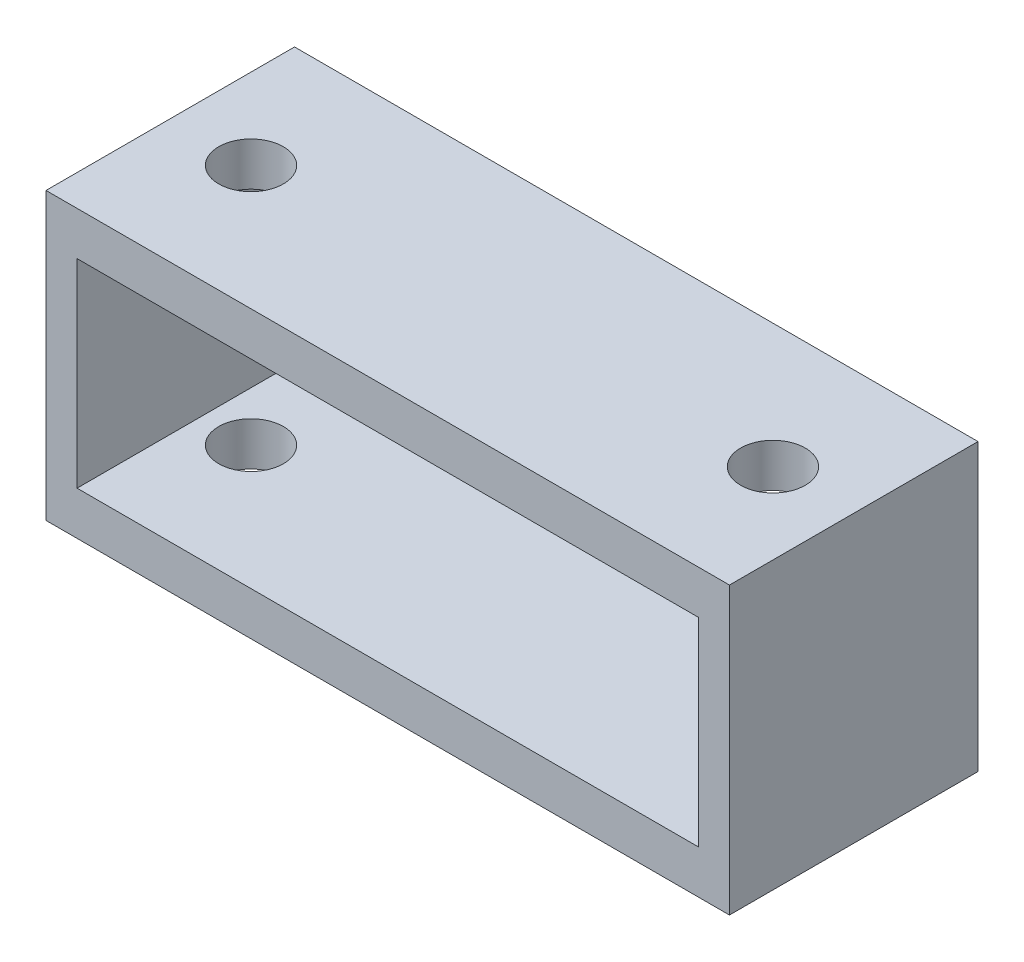
ISO-10303-21;
HEADER;
FILE_DESCRIPTION(('STEP AP214'),'2;1');
FILE_NAME('part.step','',(''),(''),'','','');
FILE_SCHEMA(('AUTOMOTIVE_DESIGN { 1 0 10303 214 1 1 1 1 }'));
ENDSEC;
DATA;
#1=APPLICATION_CONTEXT('core data for automotive mechanical design processes');
#2=APPLICATION_PROTOCOL_DEFINITION('international standard','automotive_design',2000,#1);
#3=PRODUCT_CONTEXT('',#1,'mechanical');
#4=PRODUCT('Part','Part','',(#3));
#5=PRODUCT_RELATED_PRODUCT_CATEGORY('part','',(#4));
#6=PRODUCT_DEFINITION_FORMATION('','',#4);
#7=PRODUCT_DEFINITION_CONTEXT('part definition',#1,'design');
#8=PRODUCT_DEFINITION('design','',#6,#7);
#9=PRODUCT_DEFINITION_SHAPE('','',#8);
#10=(LENGTH_UNIT() NAMED_UNIT(*) SI_UNIT(.MILLI.,.METRE.));
#11=(NAMED_UNIT(*) PLANE_ANGLE_UNIT() SI_UNIT($,.RADIAN.));
#12=(NAMED_UNIT(*) SI_UNIT($,.STERADIAN.) SOLID_ANGLE_UNIT());
#13=UNCERTAINTY_MEASURE_WITH_UNIT(LENGTH_MEASURE(1.E-05),#10,'distance_accuracy_value','');
#14=(GEOMETRIC_REPRESENTATION_CONTEXT(3) GLOBAL_UNCERTAINTY_ASSIGNED_CONTEXT((#13)) GLOBAL_UNIT_ASSIGNED_CONTEXT((#10,
#11,#12)) REPRESENTATION_CONTEXT('',''));
#15=CARTESIAN_POINT('',(0.,0.,0.));
#16=DIRECTION('',(0.,0.,1.));
#17=DIRECTION('',(1.,0.,0.));
#18=AXIS2_PLACEMENT_3D('',#15,#16,#17);
#19=CARTESIAN_POINT('',(27.5,23.,10.));
#20=DIRECTION('',(-1.,0.,0.));
#21=DIRECTION('',(0.,0.,1.));
#22=AXIS2_PLACEMENT_3D('',#19,#20,#21);
#23=PLANE('',#22);
#24=DIRECTION('',(0.,0.,-1.));
#25=VECTOR('',#24,1.);
#26=CARTESIAN_POINT('',(27.5,0.,10.));
#27=LINE('',#26,#25);
#28=CARTESIAN_POINT('',(27.5,0.,10.));
#29=VERTEX_POINT('',#28);
#30=CARTESIAN_POINT('',(27.5,0.,-10.));
#31=VERTEX_POINT('',#30);
#32=EDGE_CURVE('E117',#29,#31,#27,.T.);
#33=ORIENTED_EDGE('',*,*,#32,.T.);
#34=DIRECTION('',(0.,-1.,0.));
#35=VECTOR('',#34,1.);
#36=CARTESIAN_POINT('',(27.5,23.,-10.));
#37=LINE('',#36,#35);
#38=CARTESIAN_POINT('',(27.5,23.,-10.));
#39=VERTEX_POINT('',#38);
#40=EDGE_CURVE('E11',#39,#31,#37,.T.);
#41=ORIENTED_EDGE('',*,*,#40,.F.);
#42=DIRECTION('',(0.,0.,-1.));
#43=VECTOR('',#42,1.);
#44=CARTESIAN_POINT('',(27.5,23.,10.));
#45=LINE('',#44,#43);
#46=CARTESIAN_POINT('',(27.5,23.,10.));
#47=VERTEX_POINT('',#46);
#48=EDGE_CURVE('E140',#47,#39,#45,.T.);
#49=ORIENTED_EDGE('',*,*,#48,.F.);
#50=DIRECTION('',(0.,-1.,0.));
#51=VECTOR('',#50,1.);
#52=CARTESIAN_POINT('',(27.5,23.,10.));
#53=LINE('',#52,#51);
#54=EDGE_CURVE('E150',#47,#29,#53,.T.);
#55=ORIENTED_EDGE('',*,*,#54,.T.);
#56=EDGE_LOOP('',(#33,#41,#49,#55));
#57=FACE_BOUND('',#56,.T.);
#58=ADVANCED_FACE('F37',(#57),#23,.F.);
#59=CARTESIAN_POINT('',(-27.5,23.,-10.));
#60=DIRECTION('',(0.,0.,1.));
#61=DIRECTION('',(1.,0.,0.));
#62=AXIS2_PLACEMENT_3D('',#59,#60,#61);
#63=PLANE('',#62);
#64=DIRECTION('',(-1.,0.,0.));
#65=VECTOR('',#64,1.);
#66=CARTESIAN_POINT('',(-25.,3.5,-10.));
#67=LINE('',#66,#65);
#68=CARTESIAN_POINT('',(25.,3.5,-10.));
#69=VERTEX_POINT('',#68);
#70=CARTESIAN_POINT('',(-25.,3.5,-10.));
#71=VERTEX_POINT('',#70);
#72=EDGE_CURVE('E123',#69,#71,#67,.T.);
#73=ORIENTED_EDGE('',*,*,#72,.F.);
#74=DIRECTION('',(0.,-1.,0.));
#75=VECTOR('',#74,1.);
#76=CARTESIAN_POINT('',(25.,3.5,-10.));
#77=LINE('',#76,#75);
#78=CARTESIAN_POINT('',(25.,19.5,-10.));
#79=VERTEX_POINT('',#78);
#80=EDGE_CURVE('E105',#79,#69,#77,.T.);
#81=ORIENTED_EDGE('',*,*,#80,.F.);
#82=DIRECTION('',(1.,0.,0.));
#83=VECTOR('',#82,1.);
#84=CARTESIAN_POINT('',(-25.,19.5,-10.));
#85=LINE('',#84,#83);
#86=CARTESIAN_POINT('',(-25.,19.5,-10.));
#87=VERTEX_POINT('',#86);
#88=EDGE_CURVE('E114',#87,#79,#85,.T.);
#89=ORIENTED_EDGE('',*,*,#88,.F.);
#90=DIRECTION('',(0.,1.,0.));
#91=VECTOR('',#90,1.);
#92=CARTESIAN_POINT('',(-25.,3.5,-10.));
#93=LINE('',#92,#91);
#94=EDGE_CURVE('E53',#71,#87,#93,.T.);
#95=ORIENTED_EDGE('',*,*,#94,.F.);
#96=EDGE_LOOP('',(#73,#81,#89,#95));
#97=FACE_BOUND('',#96,.T.);
#98=DIRECTION('',(-1.,0.,0.));
#99=VECTOR('',#98,1.);
#100=CARTESIAN_POINT('',(-27.5,0.,-10.));
#101=LINE('',#100,#99);
#102=CARTESIAN_POINT('',(-27.5,0.,-10.));
#103=VERTEX_POINT('',#102);
#104=EDGE_CURVE('E153',#31,#103,#101,.T.);
#105=ORIENTED_EDGE('',*,*,#104,.T.);
#106=DIRECTION('',(0.,-1.,0.));
#107=VECTOR('',#106,1.);
#108=CARTESIAN_POINT('',(-27.5,23.,-10.));
#109=LINE('',#108,#107);
#110=CARTESIAN_POINT('',(-27.5,23.,-10.));
#111=VERTEX_POINT('',#110);
#112=EDGE_CURVE('E45',#111,#103,#109,.T.);
#113=ORIENTED_EDGE('',*,*,#112,.F.);
#114=DIRECTION('',(-1.,0.,0.));
#115=VECTOR('',#114,1.);
#116=CARTESIAN_POINT('',(-27.5,23.,-10.));
#117=LINE('',#116,#115);
#118=EDGE_CURVE('E143',#39,#111,#117,.T.);
#119=ORIENTED_EDGE('',*,*,#118,.F.);
#120=ORIENTED_EDGE('',*,*,#40,.T.);
#121=EDGE_LOOP('',(#105,#113,#119,#120));
#122=FACE_BOUND('',#121,.T.);
#123=ADVANCED_FACE('F120',(#97,#122),#63,.F.);
#124=CARTESIAN_POINT('',(-27.5,23.,10.));
#125=DIRECTION('',(1.,0.,0.));
#126=DIRECTION('',(0.,0.,-1.));
#127=AXIS2_PLACEMENT_3D('',#124,#125,#126);
#128=PLANE('',#127);
#129=DIRECTION('',(0.,0.,1.));
#130=VECTOR('',#129,1.);
#131=CARTESIAN_POINT('',(-27.5,0.,10.));
#132=LINE('',#131,#130);
#133=CARTESIAN_POINT('',(-27.5,0.,10.));
#134=VERTEX_POINT('',#133);
#135=EDGE_CURVE('E155',#103,#134,#132,.T.);
#136=ORIENTED_EDGE('',*,*,#135,.T.);
#137=DIRECTION('',(0.,-1.,0.));
#138=VECTOR('',#137,1.);
#139=CARTESIAN_POINT('',(-27.5,23.,10.));
#140=LINE('',#139,#138);
#141=CARTESIAN_POINT('',(-27.5,23.,10.));
#142=VERTEX_POINT('',#141);
#143=EDGE_CURVE('E160',#142,#134,#140,.T.);
#144=ORIENTED_EDGE('',*,*,#143,.F.);
#145=DIRECTION('',(0.,0.,1.));
#146=VECTOR('',#145,1.);
#147=CARTESIAN_POINT('',(-27.5,23.,10.));
#148=LINE('',#147,#146);
#149=EDGE_CURVE('E146',#111,#142,#148,.T.);
#150=ORIENTED_EDGE('',*,*,#149,.F.);
#151=ORIENTED_EDGE('',*,*,#112,.T.);
#152=EDGE_LOOP('',(#136,#144,#150,#151));
#153=FACE_BOUND('',#152,.T.);
#154=ADVANCED_FACE('F215',(#153),#128,.F.);
#155=CARTESIAN_POINT('',(-27.5,23.,10.));
#156=DIRECTION('',(0.,0.,-1.));
#157=DIRECTION('',(-1.,0.,0.));
#158=AXIS2_PLACEMENT_3D('',#155,#156,#157);
#159=PLANE('',#158);
#160=DIRECTION('',(-1.,0.,0.));
#161=VECTOR('',#160,1.);
#162=CARTESIAN_POINT('',(-25.,19.5,10.));
#163=LINE('',#162,#161);
#164=CARTESIAN_POINT('',(25.,19.5,10.));
#165=VERTEX_POINT('',#164);
#166=CARTESIAN_POINT('',(-25.,19.5,10.));
#167=VERTEX_POINT('',#166);
#168=EDGE_CURVE('E125',#165,#167,#163,.T.);
#169=ORIENTED_EDGE('',*,*,#168,.F.);
#170=DIRECTION('',(0.,1.,0.));
#171=VECTOR('',#170,1.);
#172=CARTESIAN_POINT('',(25.,3.5,10.));
#173=LINE('',#172,#171);
#174=CARTESIAN_POINT('',(25.,3.5,10.));
#175=VERTEX_POINT('',#174);
#176=EDGE_CURVE('E61',#175,#165,#173,.T.);
#177=ORIENTED_EDGE('',*,*,#176,.F.);
#178=DIRECTION('',(1.,0.,0.));
#179=VECTOR('',#178,1.);
#180=CARTESIAN_POINT('',(-25.,3.5,10.));
#181=LINE('',#180,#179);
#182=CARTESIAN_POINT('',(-25.,3.5,10.));
#183=VERTEX_POINT('',#182);
#184=EDGE_CURVE('E111',#183,#175,#181,.T.);
#185=ORIENTED_EDGE('',*,*,#184,.F.);
#186=DIRECTION('',(0.,-1.,0.));
#187=VECTOR('',#186,1.);
#188=CARTESIAN_POINT('',(-25.,3.5,10.));
#189=LINE('',#188,#187);
#190=EDGE_CURVE('E131',#167,#183,#189,.T.);
#191=ORIENTED_EDGE('',*,*,#190,.F.);
#192=EDGE_LOOP('',(#169,#177,#185,#191));
#193=FACE_BOUND('',#192,.T.);
#194=DIRECTION('',(1.,0.,0.));
#195=VECTOR('',#194,1.);
#196=CARTESIAN_POINT('',(-27.5,0.,10.));
#197=LINE('',#196,#195);
#198=EDGE_CURVE('E144',#134,#29,#197,.T.);
#199=ORIENTED_EDGE('',*,*,#198,.T.);
#200=ORIENTED_EDGE('',*,*,#54,.F.);
#201=DIRECTION('',(1.,0.,0.));
#202=VECTOR('',#201,1.);
#203=CARTESIAN_POINT('',(-27.5,23.,10.));
#204=LINE('',#203,#202);
#205=EDGE_CURVE('E148',#142,#47,#204,.T.);
#206=ORIENTED_EDGE('',*,*,#205,.F.);
#207=ORIENTED_EDGE('',*,*,#143,.T.);
#208=EDGE_LOOP('',(#199,#200,#206,#207));
#209=FACE_BOUND('',#208,.T.);
#210=ADVANCED_FACE('F231',(#193,#209),#159,.F.);
#211=CARTESIAN_POINT('',(0.,23.,0.));
#212=DIRECTION('',(0.,-1.,0.));
#213=DIRECTION('',(0.,0.,-1.));
#214=AXIS2_PLACEMENT_3D('',#211,#212,#213);
#215=PLANE('',#214);
#216=CARTESIAN_POINT('',(-21.,23.,0.));
#217=DIRECTION('',(0.,1.,0.));
#218=DIRECTION('',(0.,0.,1.));
#219=AXIS2_PLACEMENT_3D('',#216,#217,#218);
#220=CIRCLE('',#219,2.6);
#221=CARTESIAN_POINT('',(-21.,23.,2.6));
#222=VERTEX_POINT('',#221);
#223=EDGE_CURVE('E173',#222,#222,#220,.T.);
#224=ORIENTED_EDGE('',*,*,#223,.F.);
#225=EDGE_LOOP('',(#224));
#226=FACE_BOUND('',#225,.T.);
#227=CARTESIAN_POINT('',(21.,23.,0.));
#228=DIRECTION('',(0.,1.,0.));
#229=DIRECTION('',(0.,0.,1.));
#230=AXIS2_PLACEMENT_3D('',#227,#228,#229);
#231=CIRCLE('',#230,2.6);
#232=CARTESIAN_POINT('',(21.,23.,2.6));
#233=VERTEX_POINT('',#232);
#234=EDGE_CURVE('E178',#233,#233,#231,.T.);
#235=ORIENTED_EDGE('',*,*,#234,.F.);
#236=EDGE_LOOP('',(#235));
#237=FACE_BOUND('',#236,.T.);
#238=ORIENTED_EDGE('',*,*,#48,.T.);
#239=ORIENTED_EDGE('',*,*,#118,.T.);
#240=ORIENTED_EDGE('',*,*,#149,.T.);
#241=ORIENTED_EDGE('',*,*,#205,.T.);
#242=EDGE_LOOP('',(#238,#239,#240,#241));
#243=FACE_BOUND('',#242,.T.);
#244=ADVANCED_FACE('F227',(#226,#237,#243),#215,.F.);
#245=CARTESIAN_POINT('',(0.,0.,0.));
#246=DIRECTION('',(0.,-1.,0.));
#247=DIRECTION('',(0.,0.,-1.));
#248=AXIS2_PLACEMENT_3D('',#245,#246,#247);
#249=PLANE('',#248);
#250=CARTESIAN_POINT('',(-21.,0.,0.));
#251=DIRECTION('',(0.,-1.,0.));
#252=DIRECTION('',(0.,0.,-1.));
#253=AXIS2_PLACEMENT_3D('',#250,#251,#252);
#254=CIRCLE('',#253,2.6);
#255=CARTESIAN_POINT('',(-21.,0.,-2.6));
#256=VERTEX_POINT('',#255);
#257=EDGE_CURVE('E167',#256,#256,#254,.F.);
#258=ORIENTED_EDGE('',*,*,#257,.T.);
#259=EDGE_LOOP('',(#258));
#260=FACE_BOUND('',#259,.T.);
#261=CARTESIAN_POINT('',(21.,0.,0.));
#262=DIRECTION('',(0.,-1.,0.));
#263=DIRECTION('',(0.,0.,-1.));
#264=AXIS2_PLACEMENT_3D('',#261,#262,#263);
#265=CIRCLE('',#264,2.6);
#266=CARTESIAN_POINT('',(21.,0.,-2.6));
#267=VERTEX_POINT('',#266);
#268=EDGE_CURVE('E181',#267,#267,#265,.F.);
#269=ORIENTED_EDGE('',*,*,#268,.T.);
#270=EDGE_LOOP('',(#269));
#271=FACE_BOUND('',#270,.T.);
#272=ORIENTED_EDGE('',*,*,#32,.F.);
#273=ORIENTED_EDGE('',*,*,#198,.F.);
#274=ORIENTED_EDGE('',*,*,#135,.F.);
#275=ORIENTED_EDGE('',*,*,#104,.F.);
#276=EDGE_LOOP('',(#272,#273,#274,#275));
#277=FACE_BOUND('',#276,.T.);
#278=ADVANCED_FACE('F222',(#260,#271,#277),#249,.T.);
#279=CARTESIAN_POINT('',(25.,3.5,-10.001));
#280=DIRECTION('',(1.,0.,0.));
#281=DIRECTION('',(0.,0.,-1.));
#282=AXIS2_PLACEMENT_3D('',#279,#280,#281);
#283=PLANE('',#282);
#284=ORIENTED_EDGE('',*,*,#80,.T.);
#285=DIRECTION('',(0.,0.,1.));
#286=VECTOR('',#285,1.);
#287=CARTESIAN_POINT('',(25.,3.5,-10.001));
#288=LINE('',#287,#286);
#289=EDGE_CURVE('E118',#69,#175,#288,.T.);
#290=ORIENTED_EDGE('',*,*,#289,.T.);
#291=ORIENTED_EDGE('',*,*,#176,.T.);
#292=DIRECTION('',(0.,0.,1.));
#293=VECTOR('',#292,1.);
#294=CARTESIAN_POINT('',(25.,19.5,-10.001));
#295=LINE('',#294,#293);
#296=EDGE_CURVE('E101',#79,#165,#295,.T.);
#297=ORIENTED_EDGE('',*,*,#296,.F.);
#298=EDGE_LOOP('',(#284,#290,#291,#297));
#299=FACE_BOUND('',#298,.T.);
#300=ADVANCED_FACE('F103',(#299),#283,.F.);
#301=CARTESIAN_POINT('',(-25.,3.5,-10.001));
#302=DIRECTION('',(0.,-1.,0.));
#303=DIRECTION('',(0.,0.,-1.));
#304=AXIS2_PLACEMENT_3D('',#301,#302,#303);
#305=PLANE('',#304);
#306=CARTESIAN_POINT('',(-21.,3.5,0.));
#307=DIRECTION('',(0.,-1.,0.));
#308=DIRECTION('',(0.,0.,-1.));
#309=AXIS2_PLACEMENT_3D('',#306,#307,#308);
#310=CIRCLE('',#309,2.6);
#311=CARTESIAN_POINT('',(-21.,3.5,-2.6));
#312=VERTEX_POINT('',#311);
#313=EDGE_CURVE('E186',#312,#312,#310,.T.);
#314=ORIENTED_EDGE('',*,*,#313,.T.);
#315=EDGE_LOOP('',(#314));
#316=FACE_BOUND('',#315,.T.);
#317=CARTESIAN_POINT('',(21.,3.5,0.));
#318=DIRECTION('',(0.,-1.,0.));
#319=DIRECTION('',(0.,0.,-1.));
#320=AXIS2_PLACEMENT_3D('',#317,#318,#319);
#321=CIRCLE('',#320,2.6);
#322=CARTESIAN_POINT('',(21.,3.5,-2.6));
#323=VERTEX_POINT('',#322);
#324=EDGE_CURVE('E166',#323,#323,#321,.T.);
#325=ORIENTED_EDGE('',*,*,#324,.T.);
#326=EDGE_LOOP('',(#325));
#327=FACE_BOUND('',#326,.T.);
#328=ORIENTED_EDGE('',*,*,#72,.T.);
#329=DIRECTION('',(0.,0.,1.));
#330=VECTOR('',#329,1.);
#331=CARTESIAN_POINT('',(-25.,3.5,-10.001));
#332=LINE('',#331,#330);
#333=EDGE_CURVE('E137',#71,#183,#332,.T.);
#334=ORIENTED_EDGE('',*,*,#333,.T.);
#335=ORIENTED_EDGE('',*,*,#184,.T.);
#336=ORIENTED_EDGE('',*,*,#289,.F.);
#337=EDGE_LOOP('',(#328,#334,#335,#336));
#338=FACE_BOUND('',#337,.T.);
#339=ADVANCED_FACE('F248',(#316,#327,#338),#305,.F.);
#340=CARTESIAN_POINT('',(-25.,3.5,-10.001));
#341=DIRECTION('',(-1.,0.,0.));
#342=DIRECTION('',(0.,0.,1.));
#343=AXIS2_PLACEMENT_3D('',#340,#341,#342);
#344=PLANE('',#343);
#345=ORIENTED_EDGE('',*,*,#94,.T.);
#346=DIRECTION('',(0.,0.,1.));
#347=VECTOR('',#346,1.);
#348=CARTESIAN_POINT('',(-25.,19.5,-10.001));
#349=LINE('',#348,#347);
#350=EDGE_CURVE('E110',#87,#167,#349,.T.);
#351=ORIENTED_EDGE('',*,*,#350,.T.);
#352=ORIENTED_EDGE('',*,*,#190,.T.);
#353=ORIENTED_EDGE('',*,*,#333,.F.);
#354=EDGE_LOOP('',(#345,#351,#352,#353));
#355=FACE_BOUND('',#354,.T.);
#356=ADVANCED_FACE('F251',(#355),#344,.F.);
#357=CARTESIAN_POINT('',(-25.,19.5,-10.001));
#358=DIRECTION('',(0.,1.,0.));
#359=DIRECTION('',(0.,0.,1.));
#360=AXIS2_PLACEMENT_3D('',#357,#358,#359);
#361=PLANE('',#360);
#362=CARTESIAN_POINT('',(-21.,19.5,0.));
#363=DIRECTION('',(0.,1.,0.));
#364=DIRECTION('',(0.,0.,1.));
#365=AXIS2_PLACEMENT_3D('',#362,#363,#364);
#366=CIRCLE('',#365,2.6);
#367=CARTESIAN_POINT('',(-21.,19.5,2.6));
#368=VERTEX_POINT('',#367);
#369=EDGE_CURVE('E40',#368,#368,#366,.T.);
#370=ORIENTED_EDGE('',*,*,#369,.T.);
#371=EDGE_LOOP('',(#370));
#372=FACE_BOUND('',#371,.T.);
#373=CARTESIAN_POINT('',(21.,19.5,0.));
#374=DIRECTION('',(0.,1.,0.));
#375=DIRECTION('',(0.,0.,1.));
#376=AXIS2_PLACEMENT_3D('',#373,#374,#375);
#377=CIRCLE('',#376,2.6);
#378=CARTESIAN_POINT('',(21.,19.5,2.6));
#379=VERTEX_POINT('',#378);
#380=EDGE_CURVE('E164',#379,#379,#377,.T.);
#381=ORIENTED_EDGE('',*,*,#380,.T.);
#382=EDGE_LOOP('',(#381));
#383=FACE_BOUND('',#382,.T.);
#384=ORIENTED_EDGE('',*,*,#88,.T.);
#385=ORIENTED_EDGE('',*,*,#296,.T.);
#386=ORIENTED_EDGE('',*,*,#168,.T.);
#387=ORIENTED_EDGE('',*,*,#350,.F.);
#388=EDGE_LOOP('',(#384,#385,#386,#387));
#389=FACE_BOUND('',#388,.T.);
#390=ADVANCED_FACE('F115',(#372,#383,#389),#361,.F.);
#391=CARTESIAN_POINT('',(21.,-7.3539105243401,0.));
#392=DIRECTION('',(0.,1.,0.));
#393=DIRECTION('',(0.,0.,1.));
#394=AXIS2_PLACEMENT_3D('',#391,#392,#393);
#395=CYLINDRICAL_SURFACE('',#394,2.6);
#396=ORIENTED_EDGE('',*,*,#234,.T.);
#397=EDGE_LOOP('',(#396));
#398=FACE_BOUND('',#397,.T.);
#399=ORIENTED_EDGE('',*,*,#380,.F.);
#400=EDGE_LOOP('',(#399));
#401=FACE_BOUND('',#400,.T.);
#402=ADVANCED_FACE('F197',(#398,#401),#395,.F.);
#403=CARTESIAN_POINT('',(-21.,-7.3539105243401,0.));
#404=DIRECTION('',(0.,1.,0.));
#405=DIRECTION('',(0.,0.,1.));
#406=AXIS2_PLACEMENT_3D('',#403,#404,#405);
#407=CYLINDRICAL_SURFACE('',#406,2.6);
#408=ORIENTED_EDGE('',*,*,#223,.T.);
#409=EDGE_LOOP('',(#408));
#410=FACE_BOUND('',#409,.T.);
#411=ORIENTED_EDGE('',*,*,#369,.F.);
#412=EDGE_LOOP('',(#411));
#413=FACE_BOUND('',#412,.T.);
#414=ADVANCED_FACE('F194',(#410,#413),#407,.F.);
#415=ORIENTED_EDGE('',*,*,#268,.F.);
#416=EDGE_LOOP('',(#415));
#417=FACE_BOUND('',#416,.T.);
#418=ORIENTED_EDGE('',*,*,#324,.F.);
#419=EDGE_LOOP('',(#418));
#420=FACE_BOUND('',#419,.T.);
#421=ADVANCED_FACE('F196',(#417,#420),#395,.F.);
#422=ORIENTED_EDGE('',*,*,#257,.F.);
#423=EDGE_LOOP('',(#422));
#424=FACE_BOUND('',#423,.T.);
#425=ORIENTED_EDGE('',*,*,#313,.F.);
#426=EDGE_LOOP('',(#425));
#427=FACE_BOUND('',#426,.T.);
#428=ADVANCED_FACE('F200',(#424,#427),#407,.F.);
#429=CLOSED_SHELL('',(#58,#123,#154,#210,#244,#278,#300,#339,#356,#390,#402,#414,#421,#428));
#430=MANIFOLD_SOLID_BREP('B2',#429);
#431=ADVANCED_BREP_SHAPE_REPRESENTATION('',(#18,#430),#14);
#432=SHAPE_DEFINITION_REPRESENTATION(#9,#431);
ENDSEC;
END-ISO-10303-21;
